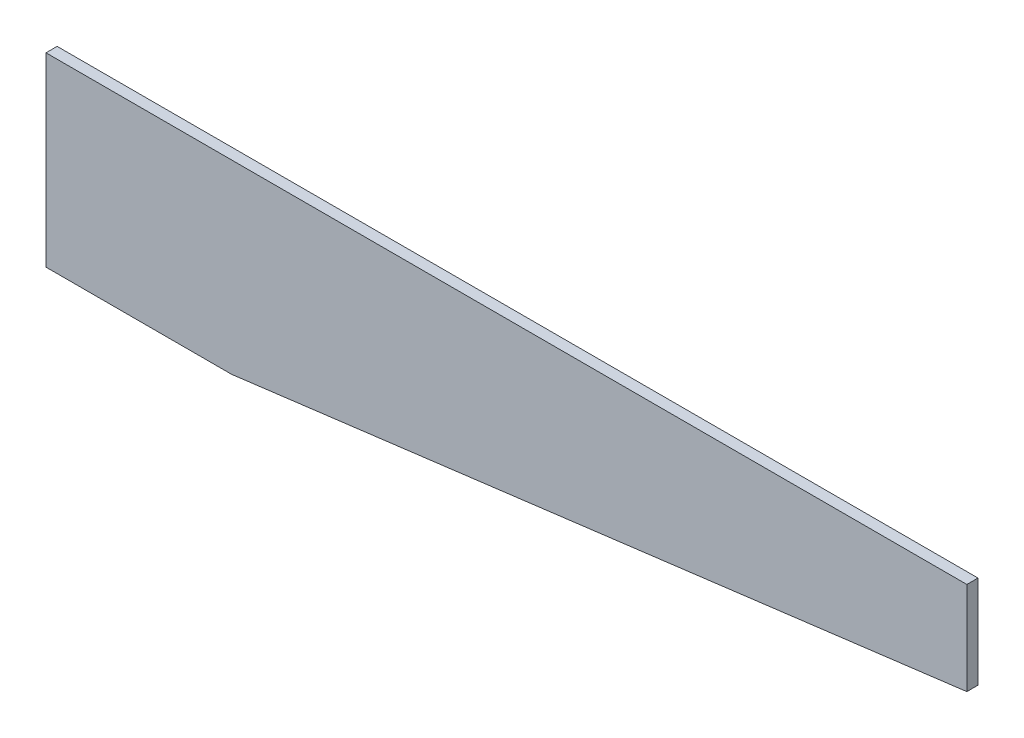
ISO-10303-21;
HEADER;
FILE_DESCRIPTION(('STEP AP214'),'2;1');
FILE_NAME('part.step','',(''),(''),'','','');
FILE_SCHEMA(('AUTOMOTIVE_DESIGN { 1 0 10303 214 1 1 1 1 }'));
ENDSEC;
DATA;
#1=APPLICATION_CONTEXT('core data for automotive mechanical design processes');
#2=APPLICATION_PROTOCOL_DEFINITION('international standard','automotive_design',2000,#1);
#3=PRODUCT_CONTEXT('',#1,'mechanical');
#4=PRODUCT('Part','Part','',(#3));
#5=PRODUCT_RELATED_PRODUCT_CATEGORY('part','',(#4));
#6=PRODUCT_DEFINITION_FORMATION('','',#4);
#7=PRODUCT_DEFINITION_CONTEXT('part definition',#1,'design');
#8=PRODUCT_DEFINITION('design','',#6,#7);
#9=PRODUCT_DEFINITION_SHAPE('','',#8);
#10=(LENGTH_UNIT() NAMED_UNIT(*) SI_UNIT(.MILLI.,.METRE.));
#11=(NAMED_UNIT(*) PLANE_ANGLE_UNIT() SI_UNIT($,.RADIAN.));
#12=(NAMED_UNIT(*) SI_UNIT($,.STERADIAN.) SOLID_ANGLE_UNIT());
#13=UNCERTAINTY_MEASURE_WITH_UNIT(LENGTH_MEASURE(1.E-05),#10,'distance_accuracy_value','');
#14=(GEOMETRIC_REPRESENTATION_CONTEXT(3) GLOBAL_UNCERTAINTY_ASSIGNED_CONTEXT((#13)) GLOBAL_UNIT_ASSIGNED_CONTEXT((#10,
#11,#12)) REPRESENTATION_CONTEXT('',''));
#15=CARTESIAN_POINT('',(0.,0.,0.));
#16=DIRECTION('',(0.,0.,1.));
#17=DIRECTION('',(1.,0.,0.));
#18=AXIS2_PLACEMENT_3D('',#15,#16,#17);
#19=CARTESIAN_POINT('',(100.,0.,-6.));
#20=DIRECTION('',(0.,-1.,0.));
#21=DIRECTION('',(1.,0.,0.));
#22=AXIS2_PLACEMENT_3D('',#19,#20,#21);
#23=PLANE('',#22);
#24=DIRECTION('',(1.,0.,0.));
#25=VECTOR('',#24,1.);
#26=CARTESIAN_POINT('',(100.,0.,0.));
#27=LINE('',#26,#25);
#28=CARTESIAN_POINT('',(0.,0.,0.));
#29=VERTEX_POINT('',#28);
#30=CARTESIAN_POINT('',(100.,0.,0.));
#31=VERTEX_POINT('',#30);
#32=EDGE_CURVE('E113',#29,#31,#27,.T.);
#33=ORIENTED_EDGE('',*,*,#32,.F.);
#34=DIRECTION('',(0.,0.,1.));
#35=VECTOR('',#34,1.);
#36=CARTESIAN_POINT('',(0.,0.,-6.));
#37=LINE('',#36,#35);
#38=CARTESIAN_POINT('',(0.,0.,-6.));
#39=VERTEX_POINT('',#38);
#40=EDGE_CURVE('E11',#39,#29,#37,.T.);
#41=ORIENTED_EDGE('',*,*,#40,.F.);
#42=DIRECTION('',(1.,0.,0.));
#43=VECTOR('',#42,1.);
#44=CARTESIAN_POINT('',(100.,0.,-6.));
#45=LINE('',#44,#43);
#46=CARTESIAN_POINT('',(100.,0.,-6.));
#47=VERTEX_POINT('',#46);
#48=EDGE_CURVE('E108',#39,#47,#45,.T.);
#49=ORIENTED_EDGE('',*,*,#48,.T.);
#50=DIRECTION('',(0.,0.,1.));
#51=VECTOR('',#50,1.);
#52=CARTESIAN_POINT('',(100.,0.,-6.));
#53=LINE('',#52,#51);
#54=EDGE_CURVE('E39',#47,#31,#53,.T.);
#55=ORIENTED_EDGE('',*,*,#54,.T.);
#56=EDGE_LOOP('',(#33,#41,#49,#55));
#57=FACE_BOUND('',#56,.T.);
#58=ADVANCED_FACE('F36',(#57),#23,.T.);
#59=CARTESIAN_POINT('',(0.,0.,-6.));
#60=DIRECTION('',(-1.,0.,0.));
#61=DIRECTION('',(0.,0.,1.));
#62=AXIS2_PLACEMENT_3D('',#59,#60,#61);
#63=PLANE('',#62);
#64=DIRECTION('',(0.,-1.,0.));
#65=VECTOR('',#64,1.);
#66=CARTESIAN_POINT('',(0.,0.,0.));
#67=LINE('',#66,#65);
#68=CARTESIAN_POINT('',(0.,100.,0.));
#69=VERTEX_POINT('',#68);
#70=EDGE_CURVE('E122',#69,#29,#67,.T.);
#71=ORIENTED_EDGE('',*,*,#70,.F.);
#72=DIRECTION('',(0.,0.,1.));
#73=VECTOR('',#72,1.);
#74=CARTESIAN_POINT('',(0.,100.,-6.));
#75=LINE('',#74,#73);
#76=CARTESIAN_POINT('',(0.,100.,-6.));
#77=VERTEX_POINT('',#76);
#78=EDGE_CURVE('E45',#77,#69,#75,.T.);
#79=ORIENTED_EDGE('',*,*,#78,.F.);
#80=DIRECTION('',(0.,-1.,0.));
#81=VECTOR('',#80,1.);
#82=CARTESIAN_POINT('',(0.,0.,-6.));
#83=LINE('',#82,#81);
#84=EDGE_CURVE('E103',#77,#39,#83,.T.);
#85=ORIENTED_EDGE('',*,*,#84,.T.);
#86=ORIENTED_EDGE('',*,*,#40,.T.);
#87=EDGE_LOOP('',(#71,#79,#85,#86));
#88=FACE_BOUND('',#87,.T.);
#89=ADVANCED_FACE('F128',(#88),#63,.T.);
#90=CARTESIAN_POINT('',(0.,100.,-6.));
#91=DIRECTION('',(0.,1.,0.));
#92=DIRECTION('',(0.,0.,1.));
#93=AXIS2_PLACEMENT_3D('',#90,#91,#92);
#94=PLANE('',#93);
#95=DIRECTION('',(-1.,0.,0.));
#96=VECTOR('',#95,1.);
#97=CARTESIAN_POINT('',(0.,100.,0.));
#98=LINE('',#97,#96);
#99=CARTESIAN_POINT('',(496.,100.,0.));
#100=VERTEX_POINT('',#99);
#101=EDGE_CURVE('E92',#100,#69,#98,.T.);
#102=ORIENTED_EDGE('',*,*,#101,.F.);
#103=DIRECTION('',(0.,0.,1.));
#104=VECTOR('',#103,1.);
#105=CARTESIAN_POINT('',(496.,100.,-6.));
#106=LINE('',#105,#104);
#107=CARTESIAN_POINT('',(496.,100.,-6.));
#108=VERTEX_POINT('',#107);
#109=EDGE_CURVE('E87',#108,#100,#106,.T.);
#110=ORIENTED_EDGE('',*,*,#109,.F.);
#111=DIRECTION('',(-1.,0.,0.));
#112=VECTOR('',#111,1.);
#113=CARTESIAN_POINT('',(0.,100.,-6.));
#114=LINE('',#113,#112);
#115=EDGE_CURVE('E90',#108,#77,#114,.T.);
#116=ORIENTED_EDGE('',*,*,#115,.T.);
#117=ORIENTED_EDGE('',*,*,#78,.T.);
#118=EDGE_LOOP('',(#102,#110,#116,#117));
#119=FACE_BOUND('',#118,.T.);
#120=ADVANCED_FACE('F89',(#119),#94,.T.);
#121=CARTESIAN_POINT('',(496.,100.,-6.));
#122=DIRECTION('',(1.,0.,0.));
#123=DIRECTION('',(0.,0.,-1.));
#124=AXIS2_PLACEMENT_3D('',#121,#122,#123);
#125=PLANE('',#124);
#126=DIRECTION('',(0.,1.,0.));
#127=VECTOR('',#126,1.);
#128=CARTESIAN_POINT('',(496.,100.,0.));
#129=LINE('',#128,#127);
#130=CARTESIAN_POINT('',(496.,50.,0.));
#131=VERTEX_POINT('',#130);
#132=EDGE_CURVE('E119',#131,#100,#129,.T.);
#133=ORIENTED_EDGE('',*,*,#132,.F.);
#134=DIRECTION('',(0.,0.,1.));
#135=VECTOR('',#134,1.);
#136=CARTESIAN_POINT('',(496.,50.,-6.));
#137=LINE('',#136,#135);
#138=CARTESIAN_POINT('',(496.,50.,-6.));
#139=VERTEX_POINT('',#138);
#140=EDGE_CURVE('E97',#139,#131,#137,.T.);
#141=ORIENTED_EDGE('',*,*,#140,.F.);
#142=DIRECTION('',(0.,1.,0.));
#143=VECTOR('',#142,1.);
#144=CARTESIAN_POINT('',(496.,100.,-6.));
#145=LINE('',#144,#143);
#146=EDGE_CURVE('E102',#139,#108,#145,.T.);
#147=ORIENTED_EDGE('',*,*,#146,.T.);
#148=ORIENTED_EDGE('',*,*,#109,.T.);
#149=EDGE_LOOP('',(#133,#141,#147,#148));
#150=FACE_BOUND('',#149,.T.);
#151=ADVANCED_FACE('F105',(#150),#125,.T.);
#152=CARTESIAN_POINT('',(496.,50.,-6.));
#153=DIRECTION('',(0.125268047233269,-0.992122934087487,0.));
#154=DIRECTION('',(0.992122934087487,0.125268047233269,0.));
#155=AXIS2_PLACEMENT_3D('',#152,#153,#154);
#156=PLANE('',#155);
#157=DIRECTION('',(0.992122934087487,0.125268047233269,0.));
#158=VECTOR('',#157,1.);
#159=CARTESIAN_POINT('',(496.,50.,0.));
#160=LINE('',#159,#158);
#161=EDGE_CURVE('E116',#31,#131,#160,.T.);
#162=ORIENTED_EDGE('',*,*,#161,.F.);
#163=ORIENTED_EDGE('',*,*,#54,.F.);
#164=DIRECTION('',(0.992122934087487,0.125268047233269,0.));
#165=VECTOR('',#164,1.);
#166=CARTESIAN_POINT('',(496.,50.,-6.));
#167=LINE('',#166,#165);
#168=EDGE_CURVE('E106',#47,#139,#167,.T.);
#169=ORIENTED_EDGE('',*,*,#168,.T.);
#170=ORIENTED_EDGE('',*,*,#140,.T.);
#171=EDGE_LOOP('',(#162,#163,#169,#170));
#172=FACE_BOUND('',#171,.T.);
#173=ADVANCED_FACE('F125',(#172),#156,.T.);
#174=CARTESIAN_POINT('',(0.,0.,-6.));
#175=DIRECTION('',(0.,0.,-1.));
#176=DIRECTION('',(-1.,0.,0.));
#177=AXIS2_PLACEMENT_3D('',#174,#175,#176);
#178=PLANE('',#177);
#179=ORIENTED_EDGE('',*,*,#48,.F.);
#180=ORIENTED_EDGE('',*,*,#84,.F.);
#181=ORIENTED_EDGE('',*,*,#115,.F.);
#182=ORIENTED_EDGE('',*,*,#146,.F.);
#183=ORIENTED_EDGE('',*,*,#168,.F.);
#184=EDGE_LOOP('',(#179,#180,#181,#182,#183));
#185=FACE_BOUND('',#184,.T.);
#186=ADVANCED_FACE('F101',(#185),#178,.T.);
#187=CARTESIAN_POINT('',(0.,0.,0.));
#188=DIRECTION('',(0.,0.,-1.));
#189=DIRECTION('',(-1.,0.,0.));
#190=AXIS2_PLACEMENT_3D('',#187,#188,#189);
#191=PLANE('',#190);
#192=ORIENTED_EDGE('',*,*,#32,.T.);
#193=ORIENTED_EDGE('',*,*,#161,.T.);
#194=ORIENTED_EDGE('',*,*,#132,.T.);
#195=ORIENTED_EDGE('',*,*,#101,.T.);
#196=ORIENTED_EDGE('',*,*,#70,.T.);
#197=EDGE_LOOP('',(#192,#193,#194,#195,#196));
#198=FACE_BOUND('',#197,.T.);
#199=ADVANCED_FACE('F127',(#198),#191,.F.);
#200=CLOSED_SHELL('',(#58,#89,#120,#151,#173,#186,#199));
#201=MANIFOLD_SOLID_BREP('B2',#200);
#202=ADVANCED_BREP_SHAPE_REPRESENTATION('',(#18,#201),#14);
#203=SHAPE_DEFINITION_REPRESENTATION(#9,#202);
ENDSEC;
END-ISO-10303-21;
